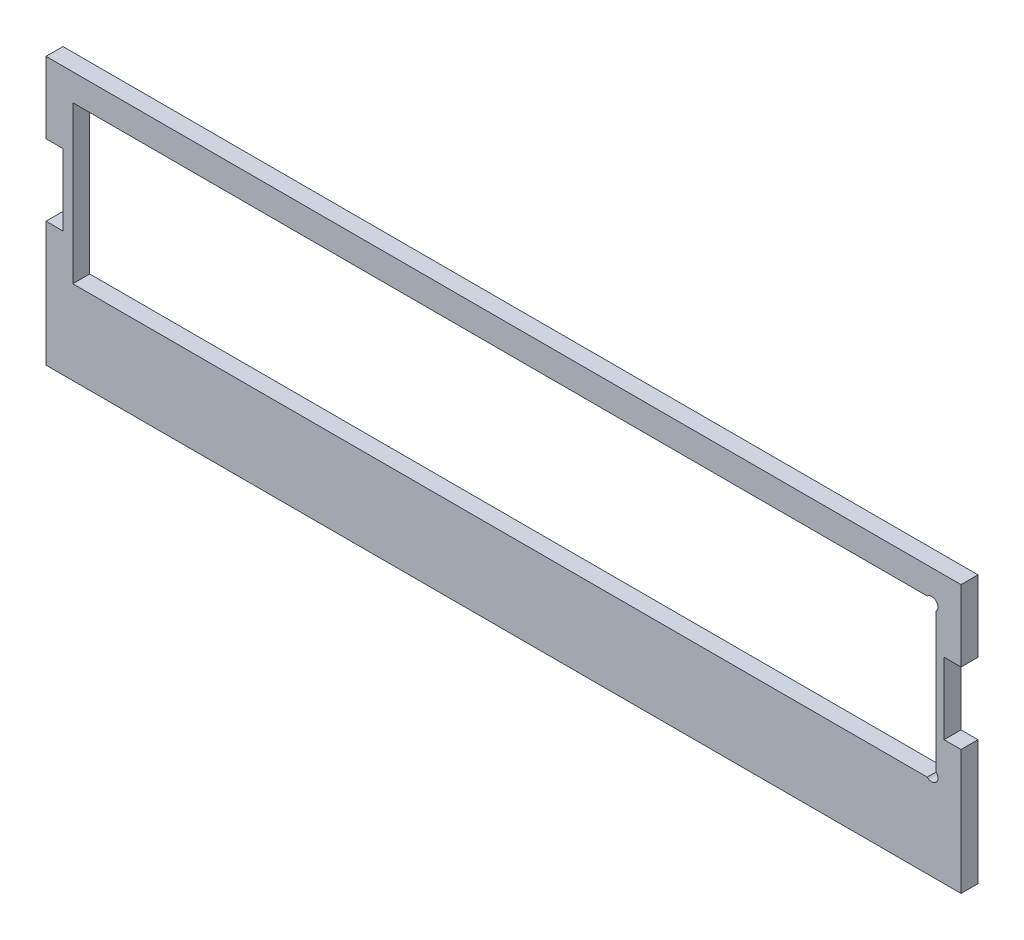
ISO-10303-21;
HEADER;
FILE_DESCRIPTION(('STEP AP214'),'2;1');
FILE_NAME('part.step','',(''),(''),'','','');
FILE_SCHEMA(('AUTOMOTIVE_DESIGN { 1 0 10303 214 1 1 1 1 }'));
ENDSEC;
DATA;
#1=APPLICATION_CONTEXT('core data for automotive mechanical design processes');
#2=APPLICATION_PROTOCOL_DEFINITION('international standard','automotive_design',2000,#1);
#3=PRODUCT_CONTEXT('',#1,'mechanical');
#4=PRODUCT('Part','Part','',(#3));
#5=PRODUCT_RELATED_PRODUCT_CATEGORY('part','',(#4));
#6=PRODUCT_DEFINITION_FORMATION('','',#4);
#7=PRODUCT_DEFINITION_CONTEXT('part definition',#1,'design');
#8=PRODUCT_DEFINITION('design','',#6,#7);
#9=PRODUCT_DEFINITION_SHAPE('','',#8);
#10=(LENGTH_UNIT() NAMED_UNIT(*) SI_UNIT(.MILLI.,.METRE.));
#11=(NAMED_UNIT(*) PLANE_ANGLE_UNIT() SI_UNIT($,.RADIAN.));
#12=(NAMED_UNIT(*) SI_UNIT($,.STERADIAN.) SOLID_ANGLE_UNIT());
#13=UNCERTAINTY_MEASURE_WITH_UNIT(LENGTH_MEASURE(1.E-05),#10,'distance_accuracy_value','');
#14=(GEOMETRIC_REPRESENTATION_CONTEXT(3) GLOBAL_UNCERTAINTY_ASSIGNED_CONTEXT((#13)) GLOBAL_UNIT_ASSIGNED_CONTEXT((#10,
#11,#12)) REPRESENTATION_CONTEXT('',''));
#15=CARTESIAN_POINT('',(0.,0.,0.));
#16=DIRECTION('',(0.,0.,1.));
#17=DIRECTION('',(1.,0.,0.));
#18=AXIS2_PLACEMENT_3D('',#15,#16,#17);
#19=CARTESIAN_POINT('',(-1865.91988168822,763.235981281031,19.));
#20=DIRECTION('',(1.,0.,0.));
#21=DIRECTION('',(0.,0.,-1.));
#22=AXIS2_PLACEMENT_3D('',#19,#20,#21);
#23=PLANE('',#22);
#24=DIRECTION('',(0.,-1.,0.));
#25=VECTOR('',#24,1.);
#26=CARTESIAN_POINT('',(-1865.91988168822,763.235981281031,0.));
#27=LINE('',#26,#25);
#28=CARTESIAN_POINT('',(-1865.91988168822,763.235981281031,0.));
#29=VERTEX_POINT('',#28);
#30=CARTESIAN_POINT('',(-1865.91988168822,683.235981281029,0.));
#31=VERTEX_POINT('',#30);
#32=EDGE_CURVE('E267',#29,#31,#27,.T.);
#33=ORIENTED_EDGE('',*,*,#32,.T.);
#34=DIRECTION('',(0.,0.,-1.));
#35=VECTOR('',#34,1.);
#36=CARTESIAN_POINT('',(-1865.91988168822,683.235981281029,0.));
#37=LINE('',#36,#35);
#38=CARTESIAN_POINT('',(-1865.91988168822,683.235981281029,19.));
#39=VERTEX_POINT('',#38);
#40=EDGE_CURVE('E173',#39,#31,#37,.T.);
#41=ORIENTED_EDGE('',*,*,#40,.F.);
#42=DIRECTION('',(0.,-1.,0.));
#43=VECTOR('',#42,1.);
#44=CARTESIAN_POINT('',(-1865.91988168822,763.235981281031,19.));
#45=LINE('',#44,#43);
#46=CARTESIAN_POINT('',(-1865.91988168822,763.235981281031,19.));
#47=VERTEX_POINT('',#46);
#48=EDGE_CURVE('E255',#47,#39,#45,.T.);
#49=ORIENTED_EDGE('',*,*,#48,.F.);
#50=DIRECTION('',(0.,0.,-1.));
#51=VECTOR('',#50,1.);
#52=CARTESIAN_POINT('',(-1865.91988168822,763.235981281031,19.));
#53=LINE('',#52,#51);
#54=EDGE_CURVE('E283',#47,#29,#53,.T.);
#55=ORIENTED_EDGE('',*,*,#54,.T.);
#56=EDGE_LOOP('',(#33,#41,#49,#55));
#57=FACE_BOUND('',#56,.T.);
#58=ADVANCED_FACE('F32',(#57),#23,.F.);
#59=CARTESIAN_POINT('',(-840.458601323645,463.501093601261,19.));
#60=DIRECTION('',(-1.,0.,0.));
#61=DIRECTION('',(0.,-1.,0.));
#62=AXIS2_PLACEMENT_3D('',#59,#60,#61);
#63=PLANE('',#62);
#64=DIRECTION('',(0.,1.,0.));
#65=VECTOR('',#64,1.);
#66=CARTESIAN_POINT('',(-840.458601323645,463.501093601261,0.));
#67=LINE('',#66,#65);
#68=CARTESIAN_POINT('',(-840.458601323645,463.501093601261,0.));
#69=VERTEX_POINT('',#68);
#70=CARTESIAN_POINT('',(-840.458601323645,603.235981281028,0.));
#71=VERTEX_POINT('',#70);
#72=EDGE_CURVE('E254',#69,#71,#67,.T.);
#73=ORIENTED_EDGE('',*,*,#72,.T.);
#74=DIRECTION('',(0.,0.,-1.));
#75=VECTOR('',#74,1.);
#76=CARTESIAN_POINT('',(-840.458601323645,603.235981281028,0.));
#77=LINE('',#76,#75);
#78=CARTESIAN_POINT('',(-840.458601323645,603.235981281028,19.));
#79=VERTEX_POINT('',#78);
#80=EDGE_CURVE('E188',#79,#71,#77,.T.);
#81=ORIENTED_EDGE('',*,*,#80,.F.);
#82=DIRECTION('',(0.,1.,0.));
#83=VECTOR('',#82,1.);
#84=CARTESIAN_POINT('',(-840.458601323645,463.501093601261,19.));
#85=LINE('',#84,#83);
#86=CARTESIAN_POINT('',(-840.458601323645,463.501093601261,19.));
#87=VERTEX_POINT('',#86);
#88=EDGE_CURVE('E261',#87,#79,#85,.T.);
#89=ORIENTED_EDGE('',*,*,#88,.F.);
#90=DIRECTION('',(0.,0.,-1.));
#91=VECTOR('',#90,1.);
#92=CARTESIAN_POINT('',(-840.458601323645,463.501093601261,19.));
#93=LINE('',#92,#91);
#94=EDGE_CURVE('E277',#87,#69,#93,.T.);
#95=ORIENTED_EDGE('',*,*,#94,.T.);
#96=EDGE_LOOP('',(#73,#81,#89,#95));
#97=FACE_BOUND('',#96,.T.);
#98=ADVANCED_FACE('F324',(#97),#63,.F.);
#99=CARTESIAN_POINT('',(-840.458601323646,763.235981281028,19.));
#100=DIRECTION('',(0.,-1.,0.));
#101=DIRECTION('',(1.,0.,0.));
#102=AXIS2_PLACEMENT_3D('',#99,#100,#101);
#103=PLANE('',#102);
#104=DIRECTION('',(-1.,0.,0.));
#105=VECTOR('',#104,1.);
#106=CARTESIAN_POINT('',(-840.458601323646,763.235981281028,0.));
#107=LINE('',#106,#105);
#108=CARTESIAN_POINT('',(-840.458601323646,763.235981281028,0.));
#109=VERTEX_POINT('',#108);
#110=EDGE_CURVE('E249',#109,#29,#107,.T.);
#111=ORIENTED_EDGE('',*,*,#110,.T.);
#112=ORIENTED_EDGE('',*,*,#54,.F.);
#113=DIRECTION('',(-1.,0.,0.));
#114=VECTOR('',#113,1.);
#115=CARTESIAN_POINT('',(-840.458601323646,763.235981281028,19.));
#116=LINE('',#115,#114);
#117=CARTESIAN_POINT('',(-840.458601323646,763.235981281028,19.));
#118=VERTEX_POINT('',#117);
#119=EDGE_CURVE('E250',#118,#47,#116,.T.);
#120=ORIENTED_EDGE('',*,*,#119,.F.);
#121=DIRECTION('',(0.,0.,-1.));
#122=VECTOR('',#121,1.);
#123=CARTESIAN_POINT('',(-840.458601323646,763.235981281028,19.));
#124=LINE('',#123,#122);
#125=EDGE_CURVE('E264',#118,#109,#124,.T.);
#126=ORIENTED_EDGE('',*,*,#125,.T.);
#127=EDGE_LOOP('',(#111,#112,#120,#126));
#128=FACE_BOUND('',#127,.T.);
#129=ADVANCED_FACE('F34',(#128),#103,.F.);
#130=CARTESIAN_POINT('',(-1865.91988168822,603.235981281029,19.));
#131=VERTEX_POINT('',#130);
#132=CARTESIAN_POINT('',(-1865.91988168822,463.501093601261,19.));
#133=VERTEX_POINT('',#132);
#134=EDGE_CURVE('E253',#131,#133,#45,.T.);
#135=ORIENTED_EDGE('',*,*,#134,.F.);
#136=DIRECTION('',(0.,0.,1.));
#137=VECTOR('',#136,1.);
#138=CARTESIAN_POINT('',(-1865.91988168822,603.235981281029,0.));
#139=LINE('',#138,#137);
#140=CARTESIAN_POINT('',(-1865.91988168822,603.235981281029,0.));
#141=VERTEX_POINT('',#140);
#142=EDGE_CURVE('E345',#141,#131,#139,.T.);
#143=ORIENTED_EDGE('',*,*,#142,.F.);
#144=CARTESIAN_POINT('',(-1865.91988168822,463.501093601261,0.));
#145=VERTEX_POINT('',#144);
#146=EDGE_CURVE('E178',#141,#145,#27,.T.);
#147=ORIENTED_EDGE('',*,*,#146,.T.);
#148=DIRECTION('',(0.,0.,-1.));
#149=VECTOR('',#148,1.);
#150=CARTESIAN_POINT('',(-1865.91988168822,463.501093601261,19.));
#151=LINE('',#150,#149);
#152=EDGE_CURVE('E280',#133,#145,#151,.T.);
#153=ORIENTED_EDGE('',*,*,#152,.F.);
#154=EDGE_LOOP('',(#135,#143,#147,#153));
#155=FACE_BOUND('',#154,.T.);
#156=ADVANCED_FACE('F326',(#155),#23,.F.);
#157=CARTESIAN_POINT('',(-1865.91988168822,463.501093601261,19.));
#158=DIRECTION('',(0.,1.,0.));
#159=DIRECTION('',(0.,0.,1.));
#160=AXIS2_PLACEMENT_3D('',#157,#158,#159);
#161=PLANE('',#160);
#162=DIRECTION('',(1.,0.,0.));
#163=VECTOR('',#162,1.);
#164=CARTESIAN_POINT('',(-1865.91988168822,463.501093601261,0.));
#165=LINE('',#164,#163);
#166=EDGE_CURVE('E270',#145,#69,#165,.T.);
#167=ORIENTED_EDGE('',*,*,#166,.T.);
#168=ORIENTED_EDGE('',*,*,#94,.F.);
#169=DIRECTION('',(1.,0.,0.));
#170=VECTOR('',#169,1.);
#171=CARTESIAN_POINT('',(-1865.91988168822,463.501093601261,19.));
#172=LINE('',#171,#170);
#173=EDGE_CURVE('E258',#133,#87,#172,.T.);
#174=ORIENTED_EDGE('',*,*,#173,.F.);
#175=ORIENTED_EDGE('',*,*,#152,.T.);
#176=EDGE_LOOP('',(#167,#168,#174,#175));
#177=FACE_BOUND('',#176,.T.);
#178=ADVANCED_FACE('F335',(#177),#161,.F.);
#179=CARTESIAN_POINT('',(-840.458601323645,683.235981281028,19.));
#180=VERTEX_POINT('',#179);
#181=EDGE_CURVE('E260',#180,#118,#85,.T.);
#182=ORIENTED_EDGE('',*,*,#181,.F.);
#183=DIRECTION('',(0.,0.,1.));
#184=VECTOR('',#183,1.);
#185=CARTESIAN_POINT('',(-840.458601323645,683.235981281028,0.));
#186=LINE('',#185,#184);
#187=CARTESIAN_POINT('',(-840.458601323645,683.235981281028,0.));
#188=VERTEX_POINT('',#187);
#189=EDGE_CURVE('E195',#188,#180,#186,.T.);
#190=ORIENTED_EDGE('',*,*,#189,.F.);
#191=EDGE_CURVE('E272',#188,#109,#67,.T.);
#192=ORIENTED_EDGE('',*,*,#191,.T.);
#193=ORIENTED_EDGE('',*,*,#125,.F.);
#194=EDGE_LOOP('',(#182,#190,#192,#193));
#195=FACE_BOUND('',#194,.T.);
#196=ADVANCED_FACE('F332',(#195),#63,.F.);
#197=CARTESIAN_POINT('',(0.,0.,19.));
#198=DIRECTION('',(0.,0.,1.));
#199=DIRECTION('',(1.,0.,0.));
#200=AXIS2_PLACEMENT_3D('',#197,#198,#199);
#201=PLANE('',#200);
#202=DIRECTION('',(-1.,0.,0.));
#203=VECTOR('',#202,1.);
#204=CARTESIAN_POINT('',(-1846.91988168822,683.235981281029,19.));
#205=LINE('',#204,#203);
#206=CARTESIAN_POINT('',(-1846.91988168822,683.235981281029,19.));
#207=VERTEX_POINT('',#206);
#208=EDGE_CURVE('E180',#207,#39,#205,.T.);
#209=ORIENTED_EDGE('',*,*,#208,.F.);
#210=DIRECTION('',(0.,1.,0.));
#211=VECTOR('',#210,1.);
#212=CARTESIAN_POINT('',(-1846.91988168822,603.235981281029,19.));
#213=LINE('',#212,#211);
#214=CARTESIAN_POINT('',(-1846.91988168822,603.235981281029,19.));
#215=VERTEX_POINT('',#214);
#216=EDGE_CURVE('E166',#215,#207,#213,.T.);
#217=ORIENTED_EDGE('',*,*,#216,.F.);
#218=DIRECTION('',(-1.,0.,0.));
#219=VECTOR('',#218,1.);
#220=CARTESIAN_POINT('',(-1846.91988168822,603.235981281029,19.));
#221=LINE('',#220,#219);
#222=EDGE_CURVE('E164',#215,#131,#221,.T.);
#223=ORIENTED_EDGE('',*,*,#222,.T.);
#224=ORIENTED_EDGE('',*,*,#134,.T.);
#225=ORIENTED_EDGE('',*,*,#173,.T.);
#226=ORIENTED_EDGE('',*,*,#88,.T.);
#227=DIRECTION('',(1.,0.,0.));
#228=VECTOR('',#227,1.);
#229=CARTESIAN_POINT('',(-859.458601323645,603.235981281028,19.));
#230=LINE('',#229,#228);
#231=CARTESIAN_POINT('',(-859.458601323645,603.235981281028,19.));
#232=VERTEX_POINT('',#231);
#233=EDGE_CURVE('E203',#232,#79,#230,.T.);
#234=ORIENTED_EDGE('',*,*,#233,.F.);
#235=DIRECTION('',(0.,-1.,0.));
#236=VECTOR('',#235,1.);
#237=CARTESIAN_POINT('',(-859.458601323645,683.235981281028,19.));
#238=LINE('',#237,#236);
#239=CARTESIAN_POINT('',(-859.458601323645,683.235981281028,19.));
#240=VERTEX_POINT('',#239);
#241=EDGE_CURVE('E191',#240,#232,#238,.T.);
#242=ORIENTED_EDGE('',*,*,#241,.F.);
#243=DIRECTION('',(1.,0.,0.));
#244=VECTOR('',#243,1.);
#245=CARTESIAN_POINT('',(-859.458601323645,683.235981281028,19.));
#246=LINE('',#245,#244);
#247=EDGE_CURVE('E205',#240,#180,#246,.T.);
#248=ORIENTED_EDGE('',*,*,#247,.T.);
#249=ORIENTED_EDGE('',*,*,#181,.T.);
#250=ORIENTED_EDGE('',*,*,#119,.T.);
#251=ORIENTED_EDGE('',*,*,#48,.T.);
#252=EDGE_LOOP('',(#209,#217,#223,#224,#225,#226,#234,#242,#248,#249,#250,#251));
#253=FACE_BOUND('',#252,.T.);
#254=CARTESIAN_POINT('',(-873.322364856059,562.392425108492,19.));
#255=DIRECTION('',(0.,0.,1.));
#256=DIRECTION('',(1.,0.,0.));
#257=AXIS2_PLACEMENT_3D('',#254,#255,#256);
#258=CIRCLE('',#257,7.00000000000004);
#259=CARTESIAN_POINT('',(-878.324848023899,557.495981281031,19.));
#260=VERTEX_POINT('',#259);
#261=CARTESIAN_POINT('',(-868.31988168822,567.288868935953,19.));
#262=VERTEX_POINT('',#261);
#263=EDGE_CURVE('E209',#260,#262,#258,.T.);
#264=ORIENTED_EDGE('',*,*,#263,.F.);
#265=DIRECTION('',(1.,0.,0.));
#266=VECTOR('',#265,1.);
#267=CARTESIAN_POINT('',(-868.31988168822,557.495981281031,19.));
#268=LINE('',#267,#266);
#269=CARTESIAN_POINT('',(-1835.91988168822,557.495981281031,19.));
#270=VERTEX_POINT('',#269);
#271=EDGE_CURVE('E240',#270,#260,#268,.T.);
#272=ORIENTED_EDGE('',*,*,#271,.F.);
#273=DIRECTION('',(0.,-1.,0.));
#274=VECTOR('',#273,1.);
#275=CARTESIAN_POINT('',(-1835.91988168822,557.495981281031,19.));
#276=LINE('',#275,#274);
#277=CARTESIAN_POINT('',(-1835.91988168822,733.235981281031,19.));
#278=VERTEX_POINT('',#277);
#279=EDGE_CURVE('E237',#278,#270,#276,.T.);
#280=ORIENTED_EDGE('',*,*,#279,.F.);
#281=DIRECTION('',(-1.,0.,0.));
#282=VECTOR('',#281,1.);
#283=CARTESIAN_POINT('',(-868.31988168822,733.235981281031,19.));
#284=LINE('',#283,#282);
#285=CARTESIAN_POINT('',(-878.324848023899,733.235981281031,19.));
#286=VERTEX_POINT('',#285);
#287=EDGE_CURVE('E235',#286,#278,#284,.T.);
#288=ORIENTED_EDGE('',*,*,#287,.F.);
#289=CARTESIAN_POINT('',(-873.322364856059,728.33953745357,19.));
#290=DIRECTION('',(0.,0.,1.));
#291=DIRECTION('',(1.,0.,0.));
#292=AXIS2_PLACEMENT_3D('',#289,#290,#291);
#293=CIRCLE('',#292,7.00000000000004);
#294=CARTESIAN_POINT('',(-868.31988168822,723.443093626109,19.));
#295=VERTEX_POINT('',#294);
#296=EDGE_CURVE('E202',#295,#286,#293,.T.);
#297=ORIENTED_EDGE('',*,*,#296,.F.);
#298=DIRECTION('',(0.,1.,0.));
#299=VECTOR('',#298,1.);
#300=CARTESIAN_POINT('',(-868.31988168822,557.495981281031,19.));
#301=LINE('',#300,#299);
#302=EDGE_CURVE('E222',#262,#295,#301,.T.);
#303=ORIENTED_EDGE('',*,*,#302,.F.);
#304=EDGE_LOOP('',(#264,#272,#280,#288,#297,#303));
#305=FACE_BOUND('',#304,.T.);
#306=ADVANCED_FACE('F295',(#253,#305),#201,.T.);
#307=CARTESIAN_POINT('',(0.,0.,0.));
#308=DIRECTION('',(0.,0.,1.));
#309=DIRECTION('',(1.,0.,0.));
#310=AXIS2_PLACEMENT_3D('',#307,#308,#309);
#311=PLANE('',#310);
#312=DIRECTION('',(-1.,0.,0.));
#313=VECTOR('',#312,1.);
#314=CARTESIAN_POINT('',(-868.31988168822,557.495981281031,0.));
#315=LINE('',#314,#313);
#316=CARTESIAN_POINT('',(-878.324848023899,557.495981281031,0.));
#317=VERTEX_POINT('',#316);
#318=CARTESIAN_POINT('',(-1835.91988168822,557.495981281031,0.));
#319=VERTEX_POINT('',#318);
#320=EDGE_CURVE('E226',#317,#319,#315,.T.);
#321=ORIENTED_EDGE('',*,*,#320,.F.);
#322=CARTESIAN_POINT('',(-873.322364856059,562.392425108492,0.));
#323=DIRECTION('',(0.,0.,1.));
#324=DIRECTION('',(1.,0.,0.));
#325=AXIS2_PLACEMENT_3D('',#322,#323,#324);
#326=CIRCLE('',#325,7.00000000000004);
#327=CARTESIAN_POINT('',(-868.31988168822,567.288868935953,0.));
#328=VERTEX_POINT('',#327);
#329=EDGE_CURVE('E211',#328,#317,#326,.F.);
#330=ORIENTED_EDGE('',*,*,#329,.F.);
#331=DIRECTION('',(0.,-1.,0.));
#332=VECTOR('',#331,1.);
#333=CARTESIAN_POINT('',(-868.31988168822,557.495981281031,0.));
#334=LINE('',#333,#332);
#335=CARTESIAN_POINT('',(-868.31988168822,723.443093626109,0.));
#336=VERTEX_POINT('',#335);
#337=EDGE_CURVE('E229',#336,#328,#334,.T.);
#338=ORIENTED_EDGE('',*,*,#337,.F.);
#339=CARTESIAN_POINT('',(-873.322364856059,728.33953745357,0.));
#340=DIRECTION('',(0.,0.,1.));
#341=DIRECTION('',(1.,0.,0.));
#342=AXIS2_PLACEMENT_3D('',#339,#340,#341);
#343=CIRCLE('',#342,7.00000000000004);
#344=CARTESIAN_POINT('',(-878.324848023899,733.235981281031,0.));
#345=VERTEX_POINT('',#344);
#346=EDGE_CURVE('E212',#345,#336,#343,.F.);
#347=ORIENTED_EDGE('',*,*,#346,.F.);
#348=DIRECTION('',(1.,0.,0.));
#349=VECTOR('',#348,1.);
#350=CARTESIAN_POINT('',(-868.31988168822,733.235981281031,0.));
#351=LINE('',#350,#349);
#352=CARTESIAN_POINT('',(-1835.91988168822,733.235981281031,0.));
#353=VERTEX_POINT('',#352);
#354=EDGE_CURVE('E232',#353,#345,#351,.T.);
#355=ORIENTED_EDGE('',*,*,#354,.F.);
#356=DIRECTION('',(0.,1.,0.));
#357=VECTOR('',#356,1.);
#358=CARTESIAN_POINT('',(-1835.91988168822,557.495981281031,0.));
#359=LINE('',#358,#357);
#360=EDGE_CURVE('E223',#319,#353,#359,.T.);
#361=ORIENTED_EDGE('',*,*,#360,.F.);
#362=EDGE_LOOP('',(#321,#330,#338,#347,#355,#361));
#363=FACE_BOUND('',#362,.T.);
#364=DIRECTION('',(0.,-1.,0.));
#365=VECTOR('',#364,1.);
#366=CARTESIAN_POINT('',(-1846.91988168822,603.235981281029,0.));
#367=LINE('',#366,#365);
#368=CARTESIAN_POINT('',(-1846.91988168822,683.235981281029,0.));
#369=VERTEX_POINT('',#368);
#370=CARTESIAN_POINT('',(-1846.91988168822,603.235981281029,0.));
#371=VERTEX_POINT('',#370);
#372=EDGE_CURVE('E167',#369,#371,#367,.T.);
#373=ORIENTED_EDGE('',*,*,#372,.F.);
#374=DIRECTION('',(-1.,0.,0.));
#375=VECTOR('',#374,1.);
#376=CARTESIAN_POINT('',(-1846.91988168822,683.235981281029,0.));
#377=LINE('',#376,#375);
#378=EDGE_CURVE('E197',#369,#31,#377,.T.);
#379=ORIENTED_EDGE('',*,*,#378,.T.);
#380=ORIENTED_EDGE('',*,*,#32,.F.);
#381=ORIENTED_EDGE('',*,*,#110,.F.);
#382=ORIENTED_EDGE('',*,*,#191,.F.);
#383=DIRECTION('',(1.,0.,0.));
#384=VECTOR('',#383,1.);
#385=CARTESIAN_POINT('',(-859.458601323645,683.235981281028,0.));
#386=LINE('',#385,#384);
#387=CARTESIAN_POINT('',(-859.458601323645,683.235981281028,0.));
#388=VERTEX_POINT('',#387);
#389=EDGE_CURVE('E194',#388,#188,#386,.T.);
#390=ORIENTED_EDGE('',*,*,#389,.F.);
#391=DIRECTION('',(0.,1.,0.));
#392=VECTOR('',#391,1.);
#393=CARTESIAN_POINT('',(-859.458601323645,683.235981281028,0.));
#394=LINE('',#393,#392);
#395=CARTESIAN_POINT('',(-859.458601323645,603.235981281028,0.));
#396=VERTEX_POINT('',#395);
#397=EDGE_CURVE('E185',#396,#388,#394,.T.);
#398=ORIENTED_EDGE('',*,*,#397,.F.);
#399=DIRECTION('',(1.,0.,0.));
#400=VECTOR('',#399,1.);
#401=CARTESIAN_POINT('',(-859.458601323645,603.235981281028,0.));
#402=LINE('',#401,#400);
#403=EDGE_CURVE('E199',#396,#71,#402,.T.);
#404=ORIENTED_EDGE('',*,*,#403,.T.);
#405=ORIENTED_EDGE('',*,*,#72,.F.);
#406=ORIENTED_EDGE('',*,*,#166,.F.);
#407=ORIENTED_EDGE('',*,*,#146,.F.);
#408=DIRECTION('',(-1.,0.,0.));
#409=VECTOR('',#408,1.);
#410=CARTESIAN_POINT('',(-1846.91988168822,603.235981281029,0.));
#411=LINE('',#410,#409);
#412=EDGE_CURVE('E161',#371,#141,#411,.T.);
#413=ORIENTED_EDGE('',*,*,#412,.F.);
#414=EDGE_LOOP('',(#373,#379,#380,#381,#382,#390,#398,#404,#405,#406,#407,#413));
#415=FACE_BOUND('',#414,.T.);
#416=ADVANCED_FACE('F176',(#363,#415),#311,.F.);
#417=CARTESIAN_POINT('',(-868.31988168822,557.495981281031,-983.429869182343));
#418=DIRECTION('',(1.,0.,0.));
#419=DIRECTION('',(0.,0.,-1.));
#420=AXIS2_PLACEMENT_3D('',#417,#418,#419);
#421=PLANE('',#420);
#422=ORIENTED_EDGE('',*,*,#337,.T.);
#423=DIRECTION('',(0.,0.,1.));
#424=VECTOR('',#423,1.);
#425=CARTESIAN_POINT('',(-868.31988168822,567.288868935953,-19.7989898732233));
#426=LINE('',#425,#424);
#427=EDGE_CURVE('E219',#328,#262,#426,.T.);
#428=ORIENTED_EDGE('',*,*,#427,.T.);
#429=ORIENTED_EDGE('',*,*,#302,.T.);
#430=DIRECTION('',(0.,0.,1.));
#431=VECTOR('',#430,1.);
#432=CARTESIAN_POINT('',(-868.31988168822,723.443093626109,-19.7989898732233));
#433=LINE('',#432,#431);
#434=EDGE_CURVE('E214',#295,#336,#433,.F.);
#435=ORIENTED_EDGE('',*,*,#434,.T.);
#436=EDGE_LOOP('',(#422,#428,#429,#435));
#437=FACE_BOUND('',#436,.T.);
#438=ADVANCED_FACE('F308',(#437),#421,.F.);
#439=CARTESIAN_POINT('',(-868.31988168822,557.495981281031,-983.429869182343));
#440=DIRECTION('',(0.,-1.,0.));
#441=DIRECTION('',(0.,0.,-1.));
#442=AXIS2_PLACEMENT_3D('',#439,#440,#441);
#443=PLANE('',#442);
#444=ORIENTED_EDGE('',*,*,#271,.T.);
#445=DIRECTION('',(0.,0.,1.));
#446=VECTOR('',#445,1.);
#447=CARTESIAN_POINT('',(-878.324848023899,557.495981281031,-19.7989898732233));
#448=LINE('',#447,#446);
#449=EDGE_CURVE('E11',#260,#317,#448,.F.);
#450=ORIENTED_EDGE('',*,*,#449,.T.);
#451=ORIENTED_EDGE('',*,*,#320,.T.);
#452=DIRECTION('',(0.,0.,1.));
#453=VECTOR('',#452,1.);
#454=CARTESIAN_POINT('',(-1835.91988168822,557.495981281031,-983.429869182343));
#455=LINE('',#454,#453);
#456=EDGE_CURVE('E227',#319,#270,#455,.T.);
#457=ORIENTED_EDGE('',*,*,#456,.T.);
#458=EDGE_LOOP('',(#444,#450,#451,#457));
#459=FACE_BOUND('',#458,.T.);
#460=ADVANCED_FACE('F313',(#459),#443,.F.);
#461=CARTESIAN_POINT('',(-1835.91988168822,557.495981281031,-983.429869182343));
#462=DIRECTION('',(-1.,0.,0.));
#463=DIRECTION('',(0.,0.,1.));
#464=AXIS2_PLACEMENT_3D('',#461,#462,#463);
#465=PLANE('',#464);
#466=ORIENTED_EDGE('',*,*,#360,.T.);
#467=DIRECTION('',(0.,0.,1.));
#468=VECTOR('',#467,1.);
#469=CARTESIAN_POINT('',(-1835.91988168822,733.235981281031,-983.429869182343));
#470=LINE('',#469,#468);
#471=EDGE_CURVE('E243',#353,#278,#470,.T.);
#472=ORIENTED_EDGE('',*,*,#471,.T.);
#473=ORIENTED_EDGE('',*,*,#279,.T.);
#474=ORIENTED_EDGE('',*,*,#456,.F.);
#475=EDGE_LOOP('',(#466,#472,#473,#474));
#476=FACE_BOUND('',#475,.T.);
#477=ADVANCED_FACE('F300',(#476),#465,.F.);
#478=CARTESIAN_POINT('',(-868.31988168822,733.235981281031,-983.429869182343));
#479=DIRECTION('',(0.,1.,0.));
#480=DIRECTION('',(0.,0.,1.));
#481=AXIS2_PLACEMENT_3D('',#478,#479,#480);
#482=PLANE('',#481);
#483=ORIENTED_EDGE('',*,*,#354,.T.);
#484=DIRECTION('',(0.,0.,1.));
#485=VECTOR('',#484,1.);
#486=CARTESIAN_POINT('',(-878.324848023899,733.235981281031,-19.7989898732233));
#487=LINE('',#486,#485);
#488=EDGE_CURVE('E40',#345,#286,#487,.T.);
#489=ORIENTED_EDGE('',*,*,#488,.T.);
#490=ORIENTED_EDGE('',*,*,#287,.T.);
#491=ORIENTED_EDGE('',*,*,#471,.F.);
#492=EDGE_LOOP('',(#483,#489,#490,#491));
#493=FACE_BOUND('',#492,.T.);
#494=ADVANCED_FACE('F289',(#493),#482,.F.);
#495=CARTESIAN_POINT('',(-873.322364856059,728.33953745357,-19.7989898732233));
#496=DIRECTION('',(0.,0.,1.));
#497=DIRECTION('',(1.,0.,0.));
#498=AXIS2_PLACEMENT_3D('',#495,#496,#497);
#499=CYLINDRICAL_SURFACE('',#498,7.00000000000004);
#500=ORIENTED_EDGE('',*,*,#296,.T.);
#501=ORIENTED_EDGE('',*,*,#488,.F.);
#502=ORIENTED_EDGE('',*,*,#346,.T.);
#503=ORIENTED_EDGE('',*,*,#434,.F.);
#504=EDGE_LOOP('',(#500,#501,#502,#503));
#505=FACE_BOUND('',#504,.T.);
#506=ADVANCED_FACE('F306',(#505),#499,.F.);
#507=CARTESIAN_POINT('',(-873.322364856059,562.392425108492,-19.7989898732233));
#508=DIRECTION('',(0.,0.,1.));
#509=DIRECTION('',(1.,0.,0.));
#510=AXIS2_PLACEMENT_3D('',#507,#508,#509);
#511=CYLINDRICAL_SURFACE('',#510,7.00000000000004);
#512=ORIENTED_EDGE('',*,*,#329,.T.);
#513=ORIENTED_EDGE('',*,*,#449,.F.);
#514=ORIENTED_EDGE('',*,*,#263,.T.);
#515=ORIENTED_EDGE('',*,*,#427,.F.);
#516=EDGE_LOOP('',(#512,#513,#514,#515));
#517=FACE_BOUND('',#516,.T.);
#518=ADVANCED_FACE('F311',(#517),#511,.F.);
#519=CARTESIAN_POINT('',(-859.458601323645,603.235981281028,0.));
#520=DIRECTION('',(0.,-1.,0.));
#521=DIRECTION('',(1.,0.,0.));
#522=AXIS2_PLACEMENT_3D('',#519,#520,#521);
#523=PLANE('',#522);
#524=ORIENTED_EDGE('',*,*,#80,.T.);
#525=ORIENTED_EDGE('',*,*,#403,.F.);
#526=DIRECTION('',(0.,0.,-1.));
#527=VECTOR('',#526,1.);
#528=CARTESIAN_POINT('',(-859.458601323645,603.235981281028,0.));
#529=LINE('',#528,#527);
#530=EDGE_CURVE('E55',#232,#396,#529,.T.);
#531=ORIENTED_EDGE('',*,*,#530,.F.);
#532=ORIENTED_EDGE('',*,*,#233,.T.);
#533=EDGE_LOOP('',(#524,#525,#531,#532));
#534=FACE_BOUND('',#533,.T.);
#535=ADVANCED_FACE('F373',(#534),#523,.F.);
#536=CARTESIAN_POINT('',(-859.458601323645,683.235981281028,0.));
#537=DIRECTION('',(0.,1.,0.));
#538=DIRECTION('',(-1.,0.,0.));
#539=AXIS2_PLACEMENT_3D('',#536,#537,#538);
#540=PLANE('',#539);
#541=ORIENTED_EDGE('',*,*,#189,.T.);
#542=ORIENTED_EDGE('',*,*,#247,.F.);
#543=DIRECTION('',(0.,0.,1.));
#544=VECTOR('',#543,1.);
#545=CARTESIAN_POINT('',(-859.458601323645,683.235981281028,0.));
#546=LINE('',#545,#544);
#547=EDGE_CURVE('E187',#388,#240,#546,.T.);
#548=ORIENTED_EDGE('',*,*,#547,.F.);
#549=ORIENTED_EDGE('',*,*,#389,.T.);
#550=EDGE_LOOP('',(#541,#542,#548,#549));
#551=FACE_BOUND('',#550,.T.);
#552=ADVANCED_FACE('F368',(#551),#540,.F.);
#553=CARTESIAN_POINT('',(-859.458601323645,0.,0.));
#554=DIRECTION('',(-1.,0.,0.));
#555=DIRECTION('',(0.,0.,1.));
#556=AXIS2_PLACEMENT_3D('',#553,#554,#555);
#557=PLANE('',#556);
#558=ORIENTED_EDGE('',*,*,#397,.T.);
#559=ORIENTED_EDGE('',*,*,#547,.T.);
#560=ORIENTED_EDGE('',*,*,#241,.T.);
#561=ORIENTED_EDGE('',*,*,#530,.T.);
#562=EDGE_LOOP('',(#558,#559,#560,#561));
#563=FACE_BOUND('',#562,.T.);
#564=ADVANCED_FACE('F371',(#563),#557,.F.);
#565=CARTESIAN_POINT('',(-1846.91988168822,683.235981281029,0.));
#566=DIRECTION('',(0.,1.,0.));
#567=DIRECTION('',(0.,0.,1.));
#568=AXIS2_PLACEMENT_3D('',#565,#566,#567);
#569=PLANE('',#568);
#570=ORIENTED_EDGE('',*,*,#40,.T.);
#571=ORIENTED_EDGE('',*,*,#378,.F.);
#572=DIRECTION('',(0.,0.,-1.));
#573=VECTOR('',#572,1.);
#574=CARTESIAN_POINT('',(-1846.91988168822,683.235981281029,0.));
#575=LINE('',#574,#573);
#576=EDGE_CURVE('E47',#207,#369,#575,.T.);
#577=ORIENTED_EDGE('',*,*,#576,.F.);
#578=ORIENTED_EDGE('',*,*,#208,.T.);
#579=EDGE_LOOP('',(#570,#571,#577,#578));
#580=FACE_BOUND('',#579,.T.);
#581=ADVANCED_FACE('F356',(#580),#569,.F.);
#582=CARTESIAN_POINT('',(-1846.91988168822,603.235981281029,0.));
#583=DIRECTION('',(0.,-1.,0.));
#584=DIRECTION('',(0.,0.,-1.));
#585=AXIS2_PLACEMENT_3D('',#582,#583,#584);
#586=PLANE('',#585);
#587=ORIENTED_EDGE('',*,*,#142,.T.);
#588=ORIENTED_EDGE('',*,*,#222,.F.);
#589=DIRECTION('',(0.,0.,1.));
#590=VECTOR('',#589,1.);
#591=CARTESIAN_POINT('',(-1846.91988168822,603.235981281029,0.));
#592=LINE('',#591,#590);
#593=EDGE_CURVE('E158',#371,#215,#592,.T.);
#594=ORIENTED_EDGE('',*,*,#593,.F.);
#595=ORIENTED_EDGE('',*,*,#412,.T.);
#596=EDGE_LOOP('',(#587,#588,#594,#595));
#597=FACE_BOUND('',#596,.T.);
#598=ADVANCED_FACE('F159',(#597),#586,.F.);
#599=CARTESIAN_POINT('',(-1846.91988168822,0.,0.));
#600=DIRECTION('',(1.,0.,0.));
#601=DIRECTION('',(0.,0.,-1.));
#602=AXIS2_PLACEMENT_3D('',#599,#600,#601);
#603=PLANE('',#602);
#604=ORIENTED_EDGE('',*,*,#372,.T.);
#605=ORIENTED_EDGE('',*,*,#593,.T.);
#606=ORIENTED_EDGE('',*,*,#216,.T.);
#607=ORIENTED_EDGE('',*,*,#576,.T.);
#608=EDGE_LOOP('',(#604,#605,#606,#607));
#609=FACE_BOUND('',#608,.T.);
#610=ADVANCED_FACE('F170',(#609),#603,.F.);
#611=CLOSED_SHELL('',(#58,#98,#129,#156,#178,#196,#306,#416,#438,#460,#477,#494,#506,#518,#535,
#552,#564,#581,#598,#610));
#612=MANIFOLD_SOLID_BREP('B2',#611);
#613=ADVANCED_BREP_SHAPE_REPRESENTATION('',(#18,#612),#14);
#614=SHAPE_DEFINITION_REPRESENTATION(#9,#613);
ENDSEC;
END-ISO-10303-21;
